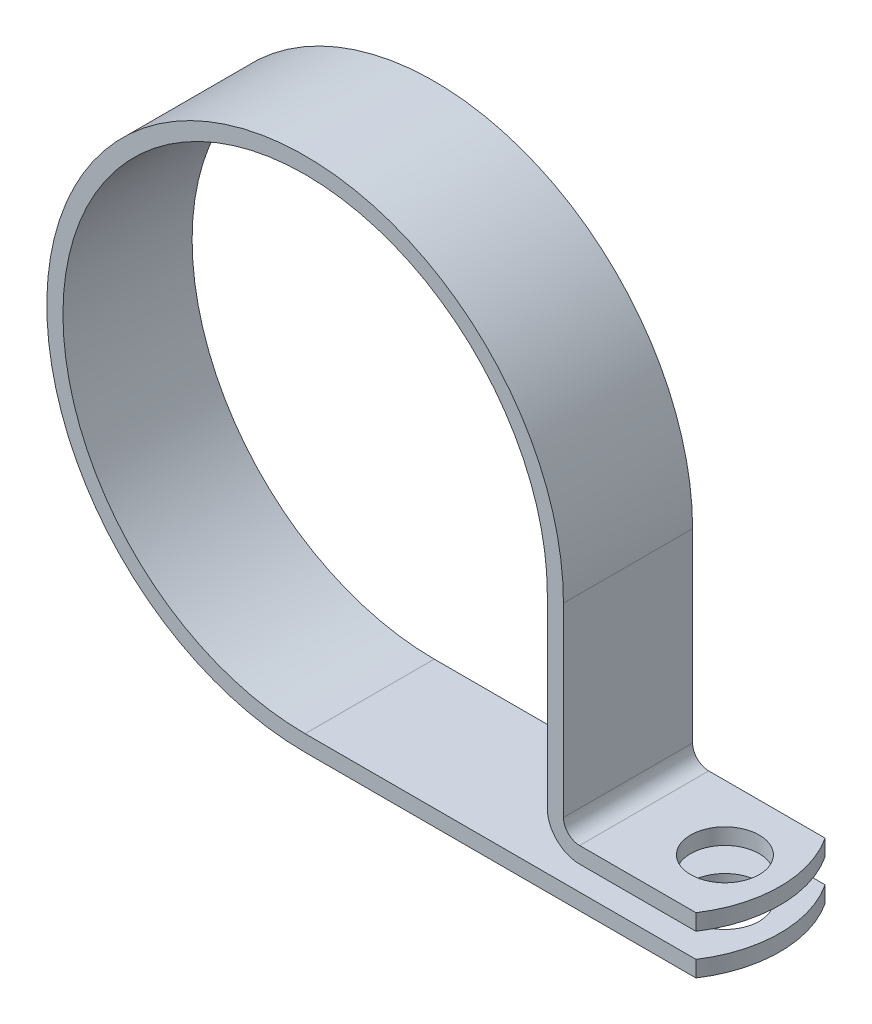
ISO-10303-21;
HEADER;
FILE_DESCRIPTION(('STEP AP214'),'2;1');
FILE_NAME('part.step','',(''),(''),'','','');
FILE_SCHEMA(('AUTOMOTIVE_DESIGN { 1 0 10303 214 1 1 1 1 }'));
ENDSEC;
DATA;
#1=APPLICATION_CONTEXT('core data for automotive mechanical design processes');
#2=APPLICATION_PROTOCOL_DEFINITION('international standard','automotive_design',2000,#1);
#3=PRODUCT_CONTEXT('',#1,'mechanical');
#4=PRODUCT('Part','Part','',(#3));
#5=PRODUCT_RELATED_PRODUCT_CATEGORY('part','',(#4));
#6=PRODUCT_DEFINITION_FORMATION('','',#4);
#7=PRODUCT_DEFINITION_CONTEXT('part definition',#1,'design');
#8=PRODUCT_DEFINITION('design','',#6,#7);
#9=PRODUCT_DEFINITION_SHAPE('','',#8);
#10=(LENGTH_UNIT() NAMED_UNIT(*) SI_UNIT(.MILLI.,.METRE.));
#11=(NAMED_UNIT(*) PLANE_ANGLE_UNIT() SI_UNIT($,.RADIAN.));
#12=(NAMED_UNIT(*) SI_UNIT($,.STERADIAN.) SOLID_ANGLE_UNIT());
#13=UNCERTAINTY_MEASURE_WITH_UNIT(LENGTH_MEASURE(1.E-05),#10,'distance_accuracy_value','');
#14=(GEOMETRIC_REPRESENTATION_CONTEXT(3) GLOBAL_UNCERTAINTY_ASSIGNED_CONTEXT((#13)) GLOBAL_UNIT_ASSIGNED_CONTEXT((#10,
#11,#12)) REPRESENTATION_CONTEXT('',''));
#15=CARTESIAN_POINT('',(0.,0.,0.));
#16=DIRECTION('',(0.,0.,1.));
#17=DIRECTION('',(1.,0.,0.));
#18=AXIS2_PLACEMENT_3D('',#15,#16,#17);
#19=CARTESIAN_POINT('',(26.9875,-21.4249,6.35));
#20=DIRECTION('',(0.,1.,0.));
#21=DIRECTION('',(0.,0.,1.));
#22=AXIS2_PLACEMENT_3D('',#19,#20,#21);
#23=PLANE('',#22);
#24=CARTESIAN_POINT('',(34.925,-21.4249,0.));
#25=DIRECTION('',(0.,1.,0.));
#26=DIRECTION('',(0.,0.,1.));
#27=AXIS2_PLACEMENT_3D('',#24,#25,#26);
#28=CIRCLE('',#27,3.3734375);
#29=CARTESIAN_POINT('',(34.925,-21.4249,3.3734375));
#30=VERTEX_POINT('',#29);
#31=EDGE_CURVE('E195',#30,#30,#28,.T.);
#32=ORIENTED_EDGE('',*,*,#31,.T.);
#33=EDGE_LOOP('',(#32));
#34=FACE_BOUND('',#33,.T.);
#35=CARTESIAN_POINT('',(28.7993666666666,-21.4249,0.));
#36=DIRECTION('',(0.,1.,0.));
#37=DIRECTION('',(0.,0.,1.));
#38=AXIS2_PLACEMENT_3D('',#35,#36,#37);
#39=CIRCLE('',#38,11.5358333333333);
#40=CARTESIAN_POINT('',(38.4302,-21.4249,6.35));
#41=VERTEX_POINT('',#40);
#42=CARTESIAN_POINT('',(38.4302,-21.4249,-6.35));
#43=VERTEX_POINT('',#42);
#44=EDGE_CURVE('E54',#41,#43,#39,.T.);
#45=ORIENTED_EDGE('',*,*,#44,.F.);
#46=DIRECTION('',(1.,0.,0.));
#47=VECTOR('',#46,1.);
#48=CARTESIAN_POINT('',(26.9875,-21.4249,6.35));
#49=LINE('',#48,#47);
#50=CARTESIAN_POINT('',(26.9875,-21.4249,6.35));
#51=VERTEX_POINT('',#50);
#52=EDGE_CURVE('E207',#51,#41,#49,.T.);
#53=ORIENTED_EDGE('',*,*,#52,.F.);
#54=DIRECTION('',(0.,0.,-1.));
#55=VECTOR('',#54,1.);
#56=CARTESIAN_POINT('',(26.9875,-21.4249,6.35));
#57=LINE('',#56,#55);
#58=CARTESIAN_POINT('',(26.9875,-21.4249,-6.35));
#59=VERTEX_POINT('',#58);
#60=EDGE_CURVE('E186',#51,#59,#57,.T.);
#61=ORIENTED_EDGE('',*,*,#60,.T.);
#62=DIRECTION('',(1.,0.,0.));
#63=VECTOR('',#62,1.);
#64=CARTESIAN_POINT('',(26.9875,-21.4249,-6.35));
#65=LINE('',#64,#63);
#66=EDGE_CURVE('E144',#59,#43,#65,.T.);
#67=ORIENTED_EDGE('',*,*,#66,.T.);
#68=EDGE_LOOP('',(#45,#53,#61,#67));
#69=FACE_BOUND('',#68,.T.);
#70=ADVANCED_FACE('F39',(#34,#69),#23,.F.);
#71=CARTESIAN_POINT('',(26.9875,-19.8374,6.35));
#72=DIRECTION('',(0.,-1.,0.));
#73=DIRECTION('',(0.,0.,-1.));
#74=AXIS2_PLACEMENT_3D('',#71,#72,#73);
#75=PLANE('',#74);
#76=CARTESIAN_POINT('',(34.925,-19.8374,0.));
#77=DIRECTION('',(0.,-1.,0.));
#78=DIRECTION('',(0.,0.,-1.));
#79=AXIS2_PLACEMENT_3D('',#76,#77,#78);
#80=CIRCLE('',#79,3.3734375);
#81=CARTESIAN_POINT('',(34.925,-19.8374,-3.3734375));
#82=VERTEX_POINT('',#81);
#83=EDGE_CURVE('E190',#82,#82,#80,.T.);
#84=ORIENTED_EDGE('',*,*,#83,.T.);
#85=EDGE_LOOP('',(#84));
#86=FACE_BOUND('',#85,.T.);
#87=CARTESIAN_POINT('',(28.7993666666666,-19.8374,0.));
#88=DIRECTION('',(0.,-1.,0.));
#89=DIRECTION('',(0.,0.,-1.));
#90=AXIS2_PLACEMENT_3D('',#87,#88,#89);
#91=CIRCLE('',#90,11.5358333333333);
#92=CARTESIAN_POINT('',(38.4302,-19.8374,-6.35));
#93=VERTEX_POINT('',#92);
#94=CARTESIAN_POINT('',(38.4302,-19.8374,6.35));
#95=VERTEX_POINT('',#94);
#96=EDGE_CURVE('E128',#93,#95,#91,.T.);
#97=ORIENTED_EDGE('',*,*,#96,.F.);
#98=DIRECTION('',(-1.,0.,0.));
#99=VECTOR('',#98,1.);
#100=CARTESIAN_POINT('',(26.9875,-19.8374,-6.35));
#101=LINE('',#100,#99);
#102=CARTESIAN_POINT('',(26.9875,-19.8374,-6.35));
#103=VERTEX_POINT('',#102);
#104=EDGE_CURVE('E132',#93,#103,#101,.T.);
#105=ORIENTED_EDGE('',*,*,#104,.T.);
#106=DIRECTION('',(0.,0.,-1.));
#107=VECTOR('',#106,1.);
#108=CARTESIAN_POINT('',(26.9875,-19.8374,6.35));
#109=LINE('',#108,#107);
#110=CARTESIAN_POINT('',(26.9875,-19.8374,6.35));
#111=VERTEX_POINT('',#110);
#112=EDGE_CURVE('E184',#111,#103,#109,.T.);
#113=ORIENTED_EDGE('',*,*,#112,.F.);
#114=DIRECTION('',(-1.,0.,0.));
#115=VECTOR('',#114,1.);
#116=CARTESIAN_POINT('',(26.9875,-19.8374,6.35));
#117=LINE('',#116,#115);
#118=EDGE_CURVE('E134',#95,#111,#117,.T.);
#119=ORIENTED_EDGE('',*,*,#118,.F.);
#120=EDGE_LOOP('',(#97,#105,#113,#119));
#121=FACE_BOUND('',#120,.T.);
#122=ADVANCED_FACE('F129',(#86,#121),#75,.F.);
#123=CARTESIAN_POINT('',(0.,-25.4,6.35));
#124=DIRECTION('',(0.,1.,0.));
#125=DIRECTION('',(0.,0.,1.));
#126=AXIS2_PLACEMENT_3D('',#123,#124,#125);
#127=PLANE('',#126);
#128=CARTESIAN_POINT('',(34.925,-25.4,0.));
#129=DIRECTION('',(0.,1.,0.));
#130=DIRECTION('',(0.,0.,1.));
#131=AXIS2_PLACEMENT_3D('',#128,#129,#130);
#132=CIRCLE('',#131,3.3734375);
#133=CARTESIAN_POINT('',(34.925,-25.4,3.3734375));
#134=VERTEX_POINT('',#133);
#135=EDGE_CURVE('E191',#134,#134,#132,.T.);
#136=ORIENTED_EDGE('',*,*,#135,.T.);
#137=EDGE_LOOP('',(#136));
#138=FACE_BOUND('',#137,.T.);
#139=CARTESIAN_POINT('',(28.7993666666666,-25.4,0.));
#140=DIRECTION('',(0.,1.,0.));
#141=DIRECTION('',(0.,0.,1.));
#142=AXIS2_PLACEMENT_3D('',#139,#140,#141);
#143=CIRCLE('',#142,11.5358333333333);
#144=CARTESIAN_POINT('',(38.4302,-25.4,6.35));
#145=VERTEX_POINT('',#144);
#146=CARTESIAN_POINT('',(38.4302,-25.4,-6.35));
#147=VERTEX_POINT('',#146);
#148=EDGE_CURVE('E61',#145,#147,#143,.T.);
#149=ORIENTED_EDGE('',*,*,#148,.F.);
#150=DIRECTION('',(1.,0.,0.));
#151=VECTOR('',#150,1.);
#152=CARTESIAN_POINT('',(0.,-25.4,6.35));
#153=LINE('',#152,#151);
#154=CARTESIAN_POINT('',(0.,-25.4,6.35));
#155=VERTEX_POINT('',#154);
#156=EDGE_CURVE('E217',#155,#145,#153,.T.);
#157=ORIENTED_EDGE('',*,*,#156,.F.);
#158=DIRECTION('',(0.,0.,-1.));
#159=VECTOR('',#158,1.);
#160=CARTESIAN_POINT('',(0.,-25.4,6.35));
#161=LINE('',#160,#159);
#162=CARTESIAN_POINT('',(0.,-25.4,-6.35));
#163=VERTEX_POINT('',#162);
#164=EDGE_CURVE('E175',#155,#163,#161,.T.);
#165=ORIENTED_EDGE('',*,*,#164,.T.);
#166=DIRECTION('',(1.,0.,0.));
#167=VECTOR('',#166,1.);
#168=CARTESIAN_POINT('',(0.,-25.4,-6.35));
#169=LINE('',#168,#167);
#170=EDGE_CURVE('E155',#163,#147,#169,.T.);
#171=ORIENTED_EDGE('',*,*,#170,.T.);
#172=EDGE_LOOP('',(#149,#157,#165,#171));
#173=FACE_BOUND('',#172,.T.);
#174=ADVANCED_FACE('F269',(#138,#173),#127,.F.);
#175=CARTESIAN_POINT('',(0.,-23.8125,6.35));
#176=DIRECTION('',(0.,-1.,0.));
#177=DIRECTION('',(0.,0.,-1.));
#178=AXIS2_PLACEMENT_3D('',#175,#176,#177);
#179=PLANE('',#178);
#180=CARTESIAN_POINT('',(34.925,-23.8125,0.));
#181=DIRECTION('',(0.,-1.,0.));
#182=DIRECTION('',(0.,0.,-1.));
#183=AXIS2_PLACEMENT_3D('',#180,#181,#182);
#184=CIRCLE('',#183,3.3734375);
#185=CARTESIAN_POINT('',(34.925,-23.8125,-3.3734375));
#186=VERTEX_POINT('',#185);
#187=EDGE_CURVE('E188',#186,#186,#184,.T.);
#188=ORIENTED_EDGE('',*,*,#187,.T.);
#189=EDGE_LOOP('',(#188));
#190=FACE_BOUND('',#189,.T.);
#191=CARTESIAN_POINT('',(28.7993666666666,-23.8125,0.));
#192=DIRECTION('',(0.,-1.,0.));
#193=DIRECTION('',(0.,0.,-1.));
#194=AXIS2_PLACEMENT_3D('',#191,#192,#193);
#195=CIRCLE('',#194,11.5358333333333);
#196=CARTESIAN_POINT('',(38.4302,-23.8125,-6.35));
#197=VERTEX_POINT('',#196);
#198=CARTESIAN_POINT('',(38.4302,-23.8125,6.35));
#199=VERTEX_POINT('',#198);
#200=EDGE_CURVE('E248',#197,#199,#195,.T.);
#201=ORIENTED_EDGE('',*,*,#200,.F.);
#202=DIRECTION('',(-1.,0.,0.));
#203=VECTOR('',#202,1.);
#204=CARTESIAN_POINT('',(0.,-23.8125,-6.35));
#205=LINE('',#204,#203);
#206=CARTESIAN_POINT('',(0.,-23.8125,-6.35));
#207=VERTEX_POINT('',#206);
#208=EDGE_CURVE('E158',#197,#207,#205,.T.);
#209=ORIENTED_EDGE('',*,*,#208,.T.);
#210=DIRECTION('',(0.,0.,-1.));
#211=VECTOR('',#210,1.);
#212=CARTESIAN_POINT('',(0.,-23.8125,6.35));
#213=LINE('',#212,#211);
#214=CARTESIAN_POINT('',(0.,-23.8125,6.35));
#215=VERTEX_POINT('',#214);
#216=EDGE_CURVE('E172',#215,#207,#213,.T.);
#217=ORIENTED_EDGE('',*,*,#216,.F.);
#218=DIRECTION('',(-1.,0.,0.));
#219=VECTOR('',#218,1.);
#220=CARTESIAN_POINT('',(0.,-23.8125,6.35));
#221=LINE('',#220,#219);
#222=EDGE_CURVE('E220',#199,#215,#221,.T.);
#223=ORIENTED_EDGE('',*,*,#222,.F.);
#224=EDGE_LOOP('',(#201,#209,#217,#223));
#225=FACE_BOUND('',#224,.T.);
#226=ADVANCED_FACE('F246',(#190,#225),#179,.F.);
#227=CARTESIAN_POINT('',(26.9875,-18.2499,6.35));
#228=DIRECTION('',(0.,0.,-1.));
#229=DIRECTION('',(-1.,0.,0.));
#230=AXIS2_PLACEMENT_3D('',#227,#228,#229);
#231=PLANE('',#230);
#232=DIRECTION('',(0.,-1.,0.));
#233=VECTOR('',#232,1.);
#234=CARTESIAN_POINT('',(38.4302,131.833541373923,6.35));
#235=LINE('',#234,#233);
#236=EDGE_CURVE('E250',#95,#41,#235,.T.);
#237=ORIENTED_EDGE('',*,*,#236,.F.);
#238=ORIENTED_EDGE('',*,*,#118,.T.);
#239=CARTESIAN_POINT('',(26.9875,-18.2499,6.35));
#240=DIRECTION('',(0.,0.,-1.));
#241=DIRECTION('',(-1.,0.,0.));
#242=AXIS2_PLACEMENT_3D('',#239,#240,#241);
#243=CIRCLE('',#242,1.5875);
#244=CARTESIAN_POINT('',(25.4,-18.2499,6.35));
#245=VERTEX_POINT('',#244);
#246=EDGE_CURVE('E211',#111,#245,#243,.T.);
#247=ORIENTED_EDGE('',*,*,#246,.T.);
#248=DIRECTION('',(0.,1.,0.));
#249=VECTOR('',#248,1.);
#250=CARTESIAN_POINT('',(25.4,0.,6.35));
#251=LINE('',#250,#249);
#252=CARTESIAN_POINT('',(25.4,0.,6.35));
#253=VERTEX_POINT('',#252);
#254=EDGE_CURVE('E213',#245,#253,#251,.T.);
#255=ORIENTED_EDGE('',*,*,#254,.T.);
#256=CARTESIAN_POINT('',(0.,0.,6.35));
#257=DIRECTION('',(0.,0.,1.));
#258=DIRECTION('',(1.,0.,0.));
#259=AXIS2_PLACEMENT_3D('',#256,#257,#258);
#260=CIRCLE('',#259,25.4);
#261=EDGE_CURVE('E215',#253,#155,#260,.T.);
#262=ORIENTED_EDGE('',*,*,#261,.T.);
#263=ORIENTED_EDGE('',*,*,#156,.T.);
#264=EDGE_CURVE('E253',#199,#145,#235,.T.);
#265=ORIENTED_EDGE('',*,*,#264,.F.);
#266=ORIENTED_EDGE('',*,*,#222,.T.);
#267=CARTESIAN_POINT('',(0.,0.,6.35));
#268=DIRECTION('',(0.,0.,-1.));
#269=DIRECTION('',(1.,0.,0.));
#270=AXIS2_PLACEMENT_3D('',#267,#268,#269);
#271=CIRCLE('',#270,23.8125);
#272=CARTESIAN_POINT('',(23.8125,0.,6.35));
#273=VERTEX_POINT('',#272);
#274=EDGE_CURVE('E222',#215,#273,#271,.T.);
#275=ORIENTED_EDGE('',*,*,#274,.T.);
#276=DIRECTION('',(0.,-1.,0.));
#277=VECTOR('',#276,1.);
#278=CARTESIAN_POINT('',(23.8125,0.,6.35));
#279=LINE('',#278,#277);
#280=CARTESIAN_POINT('',(23.8125,-18.2499,6.35));
#281=VERTEX_POINT('',#280);
#282=EDGE_CURVE('E169',#273,#281,#279,.T.);
#283=ORIENTED_EDGE('',*,*,#282,.T.);
#284=CARTESIAN_POINT('',(26.9875,-18.2499,6.35));
#285=DIRECTION('',(0.,0.,1.));
#286=DIRECTION('',(-1.,0.,0.));
#287=AXIS2_PLACEMENT_3D('',#284,#285,#286);
#288=CIRCLE('',#287,3.175);
#289=EDGE_CURVE('E164',#281,#51,#288,.T.);
#290=ORIENTED_EDGE('',*,*,#289,.T.);
#291=ORIENTED_EDGE('',*,*,#52,.T.);
#292=EDGE_LOOP('',(#237,#238,#247,#255,#262,#263,#265,#266,#275,#283,#290,#291));
#293=FACE_BOUND('',#292,.T.);
#294=ADVANCED_FACE('F234',(#293),#231,.F.);
#295=CARTESIAN_POINT('',(26.9875,-18.2499,-6.35));
#296=DIRECTION('',(0.,0.,-1.));
#297=DIRECTION('',(-1.,0.,0.));
#298=AXIS2_PLACEMENT_3D('',#295,#296,#297);
#299=PLANE('',#298);
#300=ORIENTED_EDGE('',*,*,#104,.F.);
#301=DIRECTION('',(0.,-1.,0.));
#302=VECTOR('',#301,1.);
#303=CARTESIAN_POINT('',(38.4302,131.833541373923,-6.35));
#304=LINE('',#303,#302);
#305=EDGE_CURVE('E11',#93,#43,#304,.T.);
#306=ORIENTED_EDGE('',*,*,#305,.T.);
#307=ORIENTED_EDGE('',*,*,#66,.F.);
#308=CARTESIAN_POINT('',(26.9875,-18.2499,-6.35));
#309=DIRECTION('',(0.,0.,1.));
#310=DIRECTION('',(-1.,0.,0.));
#311=AXIS2_PLACEMENT_3D('',#308,#309,#310);
#312=CIRCLE('',#311,3.175);
#313=CARTESIAN_POINT('',(23.8125,-18.2499,-6.35));
#314=VERTEX_POINT('',#313);
#315=EDGE_CURVE('E148',#314,#59,#312,.T.);
#316=ORIENTED_EDGE('',*,*,#315,.F.);
#317=DIRECTION('',(0.,-1.,0.));
#318=VECTOR('',#317,1.);
#319=CARTESIAN_POINT('',(23.8125,0.,-6.35));
#320=LINE('',#319,#318);
#321=CARTESIAN_POINT('',(23.8125,0.,-6.35));
#322=VERTEX_POINT('',#321);
#323=EDGE_CURVE('E162',#322,#314,#320,.T.);
#324=ORIENTED_EDGE('',*,*,#323,.F.);
#325=CARTESIAN_POINT('',(0.,0.,-6.35));
#326=DIRECTION('',(0.,0.,-1.));
#327=DIRECTION('',(1.,0.,0.));
#328=AXIS2_PLACEMENT_3D('',#325,#326,#327);
#329=CIRCLE('',#328,23.8125);
#330=EDGE_CURVE('E160',#207,#322,#329,.T.);
#331=ORIENTED_EDGE('',*,*,#330,.F.);
#332=ORIENTED_EDGE('',*,*,#208,.F.);
#333=EDGE_CURVE('E43',#197,#147,#304,.T.);
#334=ORIENTED_EDGE('',*,*,#333,.T.);
#335=ORIENTED_EDGE('',*,*,#170,.F.);
#336=CARTESIAN_POINT('',(0.,0.,-6.35));
#337=DIRECTION('',(0.,0.,1.));
#338=DIRECTION('',(1.,0.,0.));
#339=AXIS2_PLACEMENT_3D('',#336,#337,#338);
#340=CIRCLE('',#339,25.4);
#341=CARTESIAN_POINT('',(25.4,0.,-6.35));
#342=VERTEX_POINT('',#341);
#343=EDGE_CURVE('E153',#342,#163,#340,.T.);
#344=ORIENTED_EDGE('',*,*,#343,.F.);
#345=DIRECTION('',(0.,1.,0.));
#346=VECTOR('',#345,1.);
#347=CARTESIAN_POINT('',(25.4,0.,-6.35));
#348=LINE('',#347,#346);
#349=CARTESIAN_POINT('',(25.4,-18.2499,-6.35));
#350=VERTEX_POINT('',#349);
#351=EDGE_CURVE('E146',#350,#342,#348,.T.);
#352=ORIENTED_EDGE('',*,*,#351,.F.);
#353=CARTESIAN_POINT('',(26.9875,-18.2499,-6.35));
#354=DIRECTION('',(0.,0.,-1.));
#355=DIRECTION('',(-1.,0.,0.));
#356=AXIS2_PLACEMENT_3D('',#353,#354,#355);
#357=CIRCLE('',#356,1.5875);
#358=EDGE_CURVE('E143',#103,#350,#357,.T.);
#359=ORIENTED_EDGE('',*,*,#358,.F.);
#360=EDGE_LOOP('',(#300,#306,#307,#316,#324,#331,#332,#334,#335,#344,#352,#359));
#361=FACE_BOUND('',#360,.T.);
#362=ADVANCED_FACE('F141',(#361),#299,.T.);
#363=CARTESIAN_POINT('',(26.9875,-18.2499,6.35));
#364=DIRECTION('',(0.,0.,-1.));
#365=DIRECTION('',(-1.,0.,0.));
#366=AXIS2_PLACEMENT_3D('',#363,#364,#365);
#367=CYLINDRICAL_SURFACE('',#366,3.175);
#368=ORIENTED_EDGE('',*,*,#315,.T.);
#369=ORIENTED_EDGE('',*,*,#60,.F.);
#370=ORIENTED_EDGE('',*,*,#289,.F.);
#371=DIRECTION('',(0.,0.,-1.));
#372=VECTOR('',#371,1.);
#373=CARTESIAN_POINT('',(23.8125,-18.2499,6.35));
#374=LINE('',#373,#372);
#375=EDGE_CURVE('E165',#281,#314,#374,.T.);
#376=ORIENTED_EDGE('',*,*,#375,.T.);
#377=EDGE_LOOP('',(#368,#369,#370,#376));
#378=FACE_BOUND('',#377,.T.);
#379=ADVANCED_FACE('F41',(#378),#367,.T.);
#380=CARTESIAN_POINT('',(26.9875,-18.2499,6.35));
#381=DIRECTION('',(0.,0.,-1.));
#382=DIRECTION('',(-1.,0.,0.));
#383=AXIS2_PLACEMENT_3D('',#380,#381,#382);
#384=CYLINDRICAL_SURFACE('',#383,1.5875);
#385=ORIENTED_EDGE('',*,*,#358,.T.);
#386=DIRECTION('',(0.,0.,-1.));
#387=VECTOR('',#386,1.);
#388=CARTESIAN_POINT('',(25.4,-18.2499,6.35));
#389=LINE('',#388,#387);
#390=EDGE_CURVE('E181',#245,#350,#389,.T.);
#391=ORIENTED_EDGE('',*,*,#390,.F.);
#392=ORIENTED_EDGE('',*,*,#246,.F.);
#393=ORIENTED_EDGE('',*,*,#112,.T.);
#394=EDGE_LOOP('',(#385,#391,#392,#393));
#395=FACE_BOUND('',#394,.T.);
#396=ADVANCED_FACE('F273',(#395),#384,.F.);
#397=CARTESIAN_POINT('',(25.4,0.,6.35));
#398=DIRECTION('',(-1.,0.,0.));
#399=DIRECTION('',(0.,-1.,0.));
#400=AXIS2_PLACEMENT_3D('',#397,#398,#399);
#401=PLANE('',#400);
#402=ORIENTED_EDGE('',*,*,#351,.T.);
#403=DIRECTION('',(0.,0.,-1.));
#404=VECTOR('',#403,1.);
#405=CARTESIAN_POINT('',(25.4,0.,6.35));
#406=LINE('',#405,#404);
#407=EDGE_CURVE('E178',#253,#342,#406,.T.);
#408=ORIENTED_EDGE('',*,*,#407,.F.);
#409=ORIENTED_EDGE('',*,*,#254,.F.);
#410=ORIENTED_EDGE('',*,*,#390,.T.);
#411=EDGE_LOOP('',(#402,#408,#409,#410));
#412=FACE_BOUND('',#411,.T.);
#413=ADVANCED_FACE('F276',(#412),#401,.F.);
#414=CARTESIAN_POINT('',(0.,0.,6.35));
#415=DIRECTION('',(0.,0.,-1.));
#416=DIRECTION('',(-1.,0.,0.));
#417=AXIS2_PLACEMENT_3D('',#414,#415,#416);
#418=CYLINDRICAL_SURFACE('',#417,25.4);
#419=ORIENTED_EDGE('',*,*,#343,.T.);
#420=ORIENTED_EDGE('',*,*,#164,.F.);
#421=ORIENTED_EDGE('',*,*,#261,.F.);
#422=ORIENTED_EDGE('',*,*,#407,.T.);
#423=EDGE_LOOP('',(#419,#420,#421,#422));
#424=FACE_BOUND('',#423,.T.);
#425=ADVANCED_FACE('F280',(#424),#418,.T.);
#426=CARTESIAN_POINT('',(0.,0.,6.35));
#427=DIRECTION('',(0.,0.,-1.));
#428=DIRECTION('',(-1.,0.,0.));
#429=AXIS2_PLACEMENT_3D('',#426,#427,#428);
#430=CYLINDRICAL_SURFACE('',#429,23.8125);
#431=ORIENTED_EDGE('',*,*,#330,.T.);
#432=DIRECTION('',(0.,0.,-1.));
#433=VECTOR('',#432,1.);
#434=CARTESIAN_POINT('',(23.8125,0.,6.35));
#435=LINE('',#434,#433);
#436=EDGE_CURVE('E168',#273,#322,#435,.T.);
#437=ORIENTED_EDGE('',*,*,#436,.F.);
#438=ORIENTED_EDGE('',*,*,#274,.F.);
#439=ORIENTED_EDGE('',*,*,#216,.T.);
#440=EDGE_LOOP('',(#431,#437,#438,#439));
#441=FACE_BOUND('',#440,.T.);
#442=ADVANCED_FACE('F241',(#441),#430,.F.);
#443=CARTESIAN_POINT('',(23.8125,0.,6.35));
#444=DIRECTION('',(1.,0.,0.));
#445=DIRECTION('',(0.,0.,-1.));
#446=AXIS2_PLACEMENT_3D('',#443,#444,#445);
#447=PLANE('',#446);
#448=ORIENTED_EDGE('',*,*,#323,.T.);
#449=ORIENTED_EDGE('',*,*,#375,.F.);
#450=ORIENTED_EDGE('',*,*,#282,.F.);
#451=ORIENTED_EDGE('',*,*,#436,.T.);
#452=EDGE_LOOP('',(#448,#449,#450,#451));
#453=FACE_BOUND('',#452,.T.);
#454=ADVANCED_FACE('F239',(#453),#447,.F.);
#455=CARTESIAN_POINT('',(34.925,-25.4,0.));
#456=DIRECTION('',(0.,1.,0.));
#457=DIRECTION('',(0.,0.,1.));
#458=AXIS2_PLACEMENT_3D('',#455,#456,#457);
#459=CYLINDRICAL_SURFACE('',#458,3.3734375);
#460=ORIENTED_EDGE('',*,*,#135,.F.);
#461=EDGE_LOOP('',(#460));
#462=FACE_BOUND('',#461,.T.);
#463=ORIENTED_EDGE('',*,*,#187,.F.);
#464=EDGE_LOOP('',(#463));
#465=FACE_BOUND('',#464,.T.);
#466=ADVANCED_FACE('F261',(#462,#465),#459,.F.);
#467=ORIENTED_EDGE('',*,*,#83,.F.);
#468=EDGE_LOOP('',(#467));
#469=FACE_BOUND('',#468,.T.);
#470=ORIENTED_EDGE('',*,*,#31,.F.);
#471=EDGE_LOOP('',(#470));
#472=FACE_BOUND('',#471,.T.);
#473=ADVANCED_FACE('F255',(#469,#472),#459,.F.);
#474=CARTESIAN_POINT('',(28.7993666666666,131.833541373923,0.));
#475=DIRECTION('',(0.,-1.,0.));
#476=DIRECTION('',(0.,0.,-1.));
#477=AXIS2_PLACEMENT_3D('',#474,#475,#476);
#478=CYLINDRICAL_SURFACE('',#477,11.5358333333333);
#479=ORIENTED_EDGE('',*,*,#264,.T.);
#480=ORIENTED_EDGE('',*,*,#148,.T.);
#481=ORIENTED_EDGE('',*,*,#333,.F.);
#482=ORIENTED_EDGE('',*,*,#200,.T.);
#483=EDGE_LOOP('',(#479,#480,#481,#482));
#484=FACE_BOUND('',#483,.T.);
#485=ADVANCED_FACE('F252',(#484),#478,.T.);
#486=ORIENTED_EDGE('',*,*,#236,.T.);
#487=ORIENTED_EDGE('',*,*,#44,.T.);
#488=ORIENTED_EDGE('',*,*,#305,.F.);
#489=ORIENTED_EDGE('',*,*,#96,.T.);
#490=EDGE_LOOP('',(#486,#487,#488,#489));
#491=FACE_BOUND('',#490,.T.);
#492=ADVANCED_FACE('F137',(#491),#478,.T.);
#493=CLOSED_SHELL('',(#70,#122,#174,#226,#294,#362,#379,#396,#413,#425,#442,#454,#466,#473,#485,#492));
#494=MANIFOLD_SOLID_BREP('B2',#493);
#495=ADVANCED_BREP_SHAPE_REPRESENTATION('',(#18,#494),#14);
#496=SHAPE_DEFINITION_REPRESENTATION(#9,#495);
ENDSEC;
END-ISO-10303-21;
